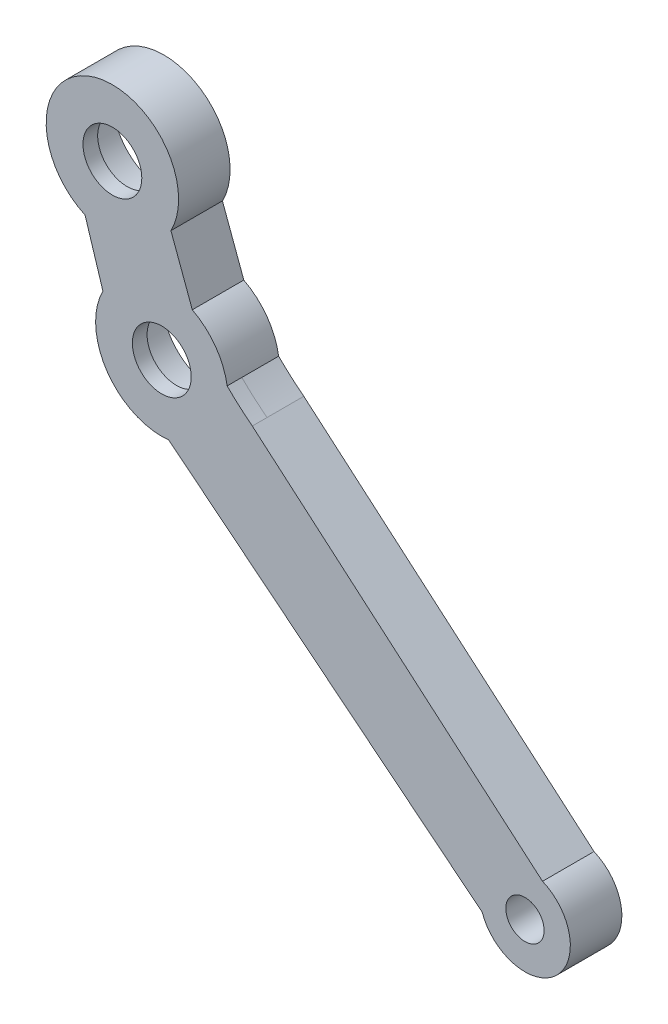
ISO-10303-21;
HEADER;
FILE_DESCRIPTION(('STEP AP214'),'2;1');
FILE_NAME('part.step','',(''),(''),'','','');
FILE_SCHEMA(('AUTOMOTIVE_DESIGN { 1 0 10303 214 1 1 1 1 }'));
ENDSEC;
DATA;
#1=APPLICATION_CONTEXT('core data for automotive mechanical design processes');
#2=APPLICATION_PROTOCOL_DEFINITION('international standard','automotive_design',2000,#1);
#3=PRODUCT_CONTEXT('',#1,'mechanical');
#4=PRODUCT('Part','Part','',(#3));
#5=PRODUCT_RELATED_PRODUCT_CATEGORY('part','',(#4));
#6=PRODUCT_DEFINITION_FORMATION('','',#4);
#7=PRODUCT_DEFINITION_CONTEXT('part definition',#1,'design');
#8=PRODUCT_DEFINITION('design','',#6,#7);
#9=PRODUCT_DEFINITION_SHAPE('','',#8);
#10=(LENGTH_UNIT() NAMED_UNIT(*) SI_UNIT(.MILLI.,.METRE.));
#11=(NAMED_UNIT(*) PLANE_ANGLE_UNIT() SI_UNIT($,.RADIAN.));
#12=(NAMED_UNIT(*) SI_UNIT($,.STERADIAN.) SOLID_ANGLE_UNIT());
#13=UNCERTAINTY_MEASURE_WITH_UNIT(LENGTH_MEASURE(1.E-05),#10,'distance_accuracy_value','');
#14=(GEOMETRIC_REPRESENTATION_CONTEXT(3) GLOBAL_UNCERTAINTY_ASSIGNED_CONTEXT((#13)) GLOBAL_UNIT_ASSIGNED_CONTEXT((#10,
#11,#12)) REPRESENTATION_CONTEXT('',''));
#15=CARTESIAN_POINT('',(0.,0.,0.));
#16=DIRECTION('',(0.,0.,1.));
#17=DIRECTION('',(1.,0.,0.));
#18=AXIS2_PLACEMENT_3D('',#15,#16,#17);
#19=CARTESIAN_POINT('',(-10.304986732744,-104.583172060792,5.68177365551215));
#20=DIRECTION('',(-0.651405865815987,-0.758729462971173,0.));
#21=DIRECTION('',(0.758729462971173,-0.651405865815987,0.));
#22=AXIS2_PLACEMENT_3D('',#19,#20,#21);
#23=PLANE('',#22);
#24=DIRECTION('',(-0.758729462971173,0.651405865815987,0.));
#25=VECTOR('',#24,1.);
#26=CARTESIAN_POINT('',(-10.304986732744,-104.583172060792,-1.81822634448785));
#27=LINE('',#26,#25);
#28=CARTESIAN_POINT('',(-102.562426797745,-25.3757067434847,-1.81822634448785));
#29=VERTEX_POINT('',#28);
#30=CARTESIAN_POINT('',(-161.728376156149,25.4211165638765,-1.81822634448785));
#31=VERTEX_POINT('',#30);
#32=EDGE_CURVE('E114',#29,#31,#27,.T.);
#33=ORIENTED_EDGE('',*,*,#32,.T.);
#34=DIRECTION('',(0.,0.,-1.));
#35=VECTOR('',#34,1.);
#36=CARTESIAN_POINT('',(-161.728376156149,25.4211165638765,5.68177365551215));
#37=LINE('',#36,#35);
#38=CARTESIAN_POINT('',(-161.728376156149,25.4211165638765,5.68177365551215));
#39=VERTEX_POINT('',#38);
#40=EDGE_CURVE('E11',#39,#31,#37,.T.);
#41=ORIENTED_EDGE('',*,*,#40,.F.);
#42=DIRECTION('',(0.,0.,-1.));
#43=VECTOR('',#42,1.);
#44=CARTESIAN_POINT('',(-161.728376156149,25.4211165638765,8.68177365551215));
#45=LINE('',#44,#43);
#46=CARTESIAN_POINT('',(-161.728376156149,25.4211165638765,8.68177365551215));
#47=VERTEX_POINT('',#46);
#48=EDGE_CURVE('E227',#47,#39,#45,.T.);
#49=ORIENTED_EDGE('',*,*,#48,.F.);
#50=DIRECTION('',(-0.758729462971173,0.651405865815987,0.));
#51=VECTOR('',#50,1.);
#52=CARTESIAN_POINT('',(-102.562426797745,-25.3757067434847,8.68177365551215));
#53=LINE('',#52,#51);
#54=CARTESIAN_POINT('',(-102.562426797745,-25.3757067434847,8.68177365551215));
#55=VERTEX_POINT('',#54);
#56=EDGE_CURVE('E117',#55,#47,#53,.T.);
#57=ORIENTED_EDGE('',*,*,#56,.F.);
#58=DIRECTION('',(0.,0.,-1.));
#59=VECTOR('',#58,1.);
#60=CARTESIAN_POINT('',(-102.562426797745,-25.3757067434847,5.68177365551215));
#61=LINE('',#60,#59);
#62=EDGE_CURVE('E103',#55,#29,#61,.T.);
#63=ORIENTED_EDGE('',*,*,#62,.T.);
#64=EDGE_LOOP('',(#33,#41,#49,#57,#63));
#65=FACE_BOUND('',#64,.T.);
#66=ADVANCED_FACE('F44',(#65),#23,.F.);
#67=CARTESIAN_POINT('',(1125655.02119039,991330.549946834,5.68177365551215));
#68=CARTESIAN_POINT('',(-1117767.06155338,-1000454.93945876,5.68177365551215));
#69=CARTESIAN_POINT('',(1109204.4083246,1009706.78276624,5.68177365551215));
#70=B_SPLINE_CURVE_WITH_KNOTS('',2,(#67,#68,#69),.UNSPECIFIED.,.F.,.F.,(3,3),(0.,1.),.UNSPECIFIED.);
#71=DIRECTION('',(0.,0.,-1.));
#72=VECTOR('',#71,1.);
#73=SURFACE_OF_LINEAR_EXTRUSION('',#70,#72);
#74=CARTESIAN_POINT('',(1125655.02119039,991330.549946834,-1.81822634448785));
#75=CARTESIAN_POINT('',(-1117767.06155338,-1000454.93945876,-1.81822634448785));
#76=CARTESIAN_POINT('',(1109204.4083246,1009706.78276624,-1.81822634448785));
#77=B_SPLINE_CURVE_WITH_KNOTS('',2,(#74,#75,#76),.UNSPECIFIED.,.F.,.F.,(3,3),(0.,1.),.UNSPECIFIED.);
#78=CARTESIAN_POINT('',(-166.855713911325,29.9366838128217,-1.81822634448785));
#79=VERTEX_POINT('',#78);
#80=EDGE_CURVE('E123',#31,#79,#77,.T.);
#81=ORIENTED_EDGE('',*,*,#80,.T.);
#82=DIRECTION('',(0.,0.,-1.));
#83=VECTOR('',#82,1.);
#84=CARTESIAN_POINT('',(-166.855713911325,29.9366838128217,5.68177365551215));
#85=LINE('',#84,#83);
#86=CARTESIAN_POINT('',(-166.855713911325,29.9366838128217,5.68177365551215));
#87=VERTEX_POINT('',#86);
#88=EDGE_CURVE('E54',#87,#79,#85,.T.);
#89=ORIENTED_EDGE('',*,*,#88,.F.);
#90=EDGE_CURVE('E109',#39,#87,#70,.T.);
#91=ORIENTED_EDGE('',*,*,#90,.F.);
#92=ORIENTED_EDGE('',*,*,#40,.T.);
#93=EDGE_LOOP('',(#81,#89,#91,#92));
#94=FACE_BOUND('',#93,.T.);
#95=ADVANCED_FACE('F249',(#94),#73,.F.);
#96=CARTESIAN_POINT('',(-180.182182863255,27.8582932732403,5.68177365551215));
#97=DIRECTION('',(0.,0.,-1.));
#98=DIRECTION('',(-1.,0.,0.));
#99=AXIS2_PLACEMENT_3D('',#96,#97,#98);
#100=CYLINDRICAL_SURFACE('',#99,13.4875676814531);
#101=CARTESIAN_POINT('',(-180.182182863255,27.8582932732403,-1.81822634448785));
#102=DIRECTION('',(0.,0.,1.));
#103=DIRECTION('',(1.,0.,0.));
#104=AXIS2_PLACEMENT_3D('',#101,#102,#103);
#105=CIRCLE('',#104,13.4875676814531);
#106=CARTESIAN_POINT('',(-173.958949505375,39.8243222108265,-1.81822634448785));
#107=VERTEX_POINT('',#106);
#108=EDGE_CURVE('E129',#79,#107,#105,.T.);
#109=ORIENTED_EDGE('',*,*,#108,.T.);
#110=DIRECTION('',(0.,0.,-1.));
#111=VECTOR('',#110,1.);
#112=CARTESIAN_POINT('',(-173.958949505375,39.8243222108265,5.68177365551215));
#113=LINE('',#112,#111);
#114=CARTESIAN_POINT('',(-173.958949495106,39.8243222305722,8.68177365551215));
#115=VERTEX_POINT('',#114);
#116=EDGE_CURVE('E174',#115,#107,#113,.T.);
#117=ORIENTED_EDGE('',*,*,#116,.F.);
#118=CARTESIAN_POINT('',(-180.182182863255,27.8582932732403,8.68177365551215));
#119=DIRECTION('',(0.,0.,1.));
#120=DIRECTION('',(1.,0.,0.));
#121=AXIS2_PLACEMENT_3D('',#118,#119,#120);
#122=CIRCLE('',#121,13.4875677037096);
#123=CARTESIAN_POINT('',(-166.855713804423,29.9366837051627,8.68177365551215));
#124=VERTEX_POINT('',#123);
#125=EDGE_CURVE('E214',#124,#115,#122,.T.);
#126=ORIENTED_EDGE('',*,*,#125,.F.);
#127=DIRECTION('',(0.,0.,-1.));
#128=VECTOR('',#127,1.);
#129=CARTESIAN_POINT('',(-166.855713804423,29.9366837051627,8.68177365551215));
#130=LINE('',#129,#128);
#131=EDGE_CURVE('E184',#124,#87,#130,.T.);
#132=ORIENTED_EDGE('',*,*,#131,.T.);
#133=ORIENTED_EDGE('',*,*,#88,.T.);
#134=EDGE_LOOP('',(#109,#117,#126,#132,#133));
#135=FACE_BOUND('',#134,.T.);
#136=ADVANCED_FACE('F180',(#135),#100,.T.);
#137=CARTESIAN_POINT('',(-129.667144340121,-80.0454105266062,5.68177365551215));
#138=DIRECTION('',(-0.938014544046687,-0.346595896047381,0.));
#139=DIRECTION('',(0.346595896047381,-0.938014544046687,0.));
#140=AXIS2_PLACEMENT_3D('',#137,#138,#139);
#141=PLANE('',#140);
#142=DIRECTION('',(-0.346595896047381,0.938014544046687,0.));
#143=VECTOR('',#142,1.);
#144=CARTESIAN_POINT('',(-129.667144340121,-80.0454105266062,-1.81822634448785));
#145=LINE('',#144,#143);
#146=CARTESIAN_POINT('',(-178.317702817252,51.6206938559562,-1.81822634448785));
#147=VERTEX_POINT('',#146);
#148=EDGE_CURVE('E143',#107,#147,#145,.T.);
#149=ORIENTED_EDGE('',*,*,#148,.T.);
#150=DIRECTION('',(0.,0.,-1.));
#151=VECTOR('',#150,1.);
#152=CARTESIAN_POINT('',(-178.317702817252,51.6206938559562,5.68177365551215));
#153=LINE('',#152,#151);
#154=CARTESIAN_POINT('',(-178.317702817252,51.6206938559562,8.68177365551215));
#155=VERTEX_POINT('',#154);
#156=EDGE_CURVE('E170',#155,#147,#153,.T.);
#157=ORIENTED_EDGE('',*,*,#156,.F.);
#158=DIRECTION('',(-0.346595896047381,0.938014544046686,0.));
#159=VECTOR('',#158,1.);
#160=CARTESIAN_POINT('',(-173.958949505375,39.8243222108265,8.68177365551215));
#161=LINE('',#160,#159);
#162=EDGE_CURVE('E208',#115,#155,#161,.T.);
#163=ORIENTED_EDGE('',*,*,#162,.F.);
#164=ORIENTED_EDGE('',*,*,#116,.T.);
#165=EDGE_LOOP('',(#149,#157,#163,#164));
#166=FACE_BOUND('',#165,.T.);
#167=ADVANCED_FACE('F190',(#166),#141,.F.);
#168=CARTESIAN_POINT('',(-190.253513875317,57.9283411500087,5.68177365551215));
#169=DIRECTION('',(0.,0.,-1.));
#170=DIRECTION('',(-1.,0.,0.));
#171=AXIS2_PLACEMENT_3D('',#168,#169,#170);
#172=CYLINDRICAL_SURFACE('',#171,13.5);
#173=CARTESIAN_POINT('',(-190.253513875317,57.9283411500087,-1.81822634448785));
#174=DIRECTION('',(0.,0.,1.));
#175=DIRECTION('',(1.,0.,0.));
#176=AXIS2_PLACEMENT_3D('',#173,#174,#175);
#177=CIRCLE('',#176,13.5);
#178=CARTESIAN_POINT('',(-195.824418154913,45.6313892712878,-1.81822634448785));
#179=VERTEX_POINT('',#178);
#180=EDGE_CURVE('E146',#147,#179,#177,.T.);
#181=ORIENTED_EDGE('',*,*,#180,.T.);
#182=DIRECTION('',(0.,0.,-1.));
#183=VECTOR('',#182,1.);
#184=CARTESIAN_POINT('',(-195.824418154913,45.6313892712878,5.68177365551215));
#185=LINE('',#184,#183);
#186=CARTESIAN_POINT('',(-195.824418154913,45.6313892712878,8.68177365551215));
#187=VERTEX_POINT('',#186);
#188=EDGE_CURVE('E166',#187,#179,#185,.T.);
#189=ORIENTED_EDGE('',*,*,#188,.F.);
#190=CARTESIAN_POINT('',(-190.253513875317,57.9283411500087,8.68177365551215));
#191=DIRECTION('',(0.,0.,1.));
#192=DIRECTION('',(1.,0.,0.));
#193=AXIS2_PLACEMENT_3D('',#190,#191,#192);
#194=CIRCLE('',#193,13.5);
#195=EDGE_CURVE('E199',#155,#187,#194,.T.);
#196=ORIENTED_EDGE('',*,*,#195,.F.);
#197=ORIENTED_EDGE('',*,*,#156,.T.);
#198=EDGE_LOOP('',(#181,#189,#196,#197));
#199=FACE_BOUND('',#198,.T.);
#200=ADVANCED_FACE('F196',(#199),#172,.T.);
#201=CARTESIAN_POINT('',(-157.308177848066,-77.2059147968634,5.68177365551215));
#202=DIRECTION('',(0.954192963420192,0.2991918925362,0.));
#203=DIRECTION('',(-0.2991918925362,0.954192963420192,0.));
#204=AXIS2_PLACEMENT_3D('',#201,#202,#203);
#205=PLANE('',#204);
#206=DIRECTION('',(0.2991918925362,-0.954192963420192,0.));
#207=VECTOR('',#206,1.);
#208=CARTESIAN_POINT('',(-157.308177848066,-77.2059147968634,-1.81822634448785));
#209=LINE('',#208,#207);
#210=CARTESIAN_POINT('',(-192.182244828685,34.0156461775026,-1.81822634448785));
#211=VERTEX_POINT('',#210);
#212=EDGE_CURVE('E149',#179,#211,#209,.T.);
#213=ORIENTED_EDGE('',*,*,#212,.T.);
#214=DIRECTION('',(0.,0.,-1.));
#215=VECTOR('',#214,1.);
#216=CARTESIAN_POINT('',(-192.182244828685,34.0156461775026,5.68177365551215));
#217=LINE('',#216,#215);
#218=CARTESIAN_POINT('',(-192.182244828685,34.0156461775026,8.68177365551215));
#219=VERTEX_POINT('',#218);
#220=EDGE_CURVE('E162',#219,#211,#217,.T.);
#221=ORIENTED_EDGE('',*,*,#220,.F.);
#222=DIRECTION('',(0.2991918925362,-0.954192963420192,0.));
#223=VECTOR('',#222,1.);
#224=CARTESIAN_POINT('',(-195.824418154913,45.6313892712878,8.68177365551215));
#225=LINE('',#224,#223);
#226=EDGE_CURVE('E207',#187,#219,#225,.T.);
#227=ORIENTED_EDGE('',*,*,#226,.F.);
#228=ORIENTED_EDGE('',*,*,#188,.T.);
#229=EDGE_LOOP('',(#213,#221,#227,#228));
#230=FACE_BOUND('',#229,.T.);
#231=ADVANCED_FACE('F337',(#230),#205,.F.);
#232=CARTESIAN_POINT('',(-180.182182863255,27.8582932732403,5.68177365551215));
#233=DIRECTION('',(0.,0.,-1.));
#234=DIRECTION('',(-1.,0.,0.));
#235=AXIS2_PLACEMENT_3D('',#232,#233,#234);
#236=CYLINDRICAL_SURFACE('',#235,13.4875676814531);
#237=CARTESIAN_POINT('',(-180.182182863255,27.8582932732403,-1.81822634448785));
#238=DIRECTION('',(0.,0.,1.));
#239=DIRECTION('',(1.,0.,0.));
#240=AXIS2_PLACEMENT_3D('',#237,#238,#239);
#241=CIRCLE('',#240,13.4875676814531);
#242=CARTESIAN_POINT('',(-178.777746482207,14.4440456084115,-1.81822634448785));
#243=VERTEX_POINT('',#242);
#244=EDGE_CURVE('E152',#211,#243,#241,.T.);
#245=ORIENTED_EDGE('',*,*,#244,.T.);
#246=DIRECTION('',(0.,0.,-1.));
#247=VECTOR('',#246,1.);
#248=CARTESIAN_POINT('',(-178.777746482207,14.4440456084115,5.68177365551215));
#249=LINE('',#248,#247);
#250=CARTESIAN_POINT('',(-178.777746482207,14.4440456084115,8.68177365551215));
#251=VERTEX_POINT('',#250);
#252=EDGE_CURVE('E159',#251,#243,#249,.T.);
#253=ORIENTED_EDGE('',*,*,#252,.F.);
#254=CARTESIAN_POINT('',(-180.182182863255,27.8582932732403,8.68177365551215));
#255=DIRECTION('',(0.,0.,1.));
#256=DIRECTION('',(1.,0.,0.));
#257=AXIS2_PLACEMENT_3D('',#254,#255,#256);
#258=CIRCLE('',#257,13.4875676814531);
#259=EDGE_CURVE('E212',#219,#251,#258,.T.);
#260=ORIENTED_EDGE('',*,*,#259,.F.);
#261=ORIENTED_EDGE('',*,*,#220,.T.);
#262=EDGE_LOOP('',(#245,#253,#260,#261));
#263=FACE_BOUND('',#262,.T.);
#264=ADVANCED_FACE('F334',(#263),#236,.T.);
#265=CARTESIAN_POINT('',(-15.0359852391694,-117.249538452131,5.68177365551215));
#266=DIRECTION('',(0.626724705023871,0.77924074849352,0.));
#267=DIRECTION('',(-0.77924074849352,0.626724705023871,0.));
#268=AXIS2_PLACEMENT_3D('',#265,#266,#267);
#269=PLANE('',#268);
#270=DIRECTION('',(0.77924074849352,-0.626724705023871,0.));
#271=VECTOR('',#270,1.);
#272=CARTESIAN_POINT('',(-15.0359852391694,-117.249538452131,-1.81822634448785));
#273=LINE('',#272,#271);
#274=CARTESIAN_POINT('',(-114.871454366241,-36.9542573589044,-1.81822634448785));
#275=VERTEX_POINT('',#274);
#276=EDGE_CURVE('E92',#243,#275,#273,.T.);
#277=ORIENTED_EDGE('',*,*,#276,.T.);
#278=DIRECTION('',(0.,0.,-1.));
#279=VECTOR('',#278,1.);
#280=CARTESIAN_POINT('',(-114.871454366241,-36.9542573589044,5.68177365551215));
#281=LINE('',#280,#279);
#282=CARTESIAN_POINT('',(-114.871454366241,-36.9542573589044,8.68177365551215));
#283=VERTEX_POINT('',#282);
#284=EDGE_CURVE('E105',#283,#275,#281,.T.);
#285=ORIENTED_EDGE('',*,*,#284,.F.);
#286=DIRECTION('',(0.77924074849352,-0.626724705023871,0.));
#287=VECTOR('',#286,1.);
#288=CARTESIAN_POINT('',(-178.777746482207,14.4440456084115,8.68177365551215));
#289=LINE('',#288,#287);
#290=EDGE_CURVE('E221',#251,#283,#289,.T.);
#291=ORIENTED_EDGE('',*,*,#290,.F.);
#292=ORIENTED_EDGE('',*,*,#252,.T.);
#293=EDGE_LOOP('',(#277,#285,#291,#292));
#294=FACE_BOUND('',#293,.T.);
#295=ADVANCED_FACE('F259',(#294),#269,.F.);
#296=CARTESIAN_POINT('',(-106.13890499212,-33.9056628326092,5.68177365551215));
#297=DIRECTION('',(0.,0.,-1.));
#298=DIRECTION('',(-1.,0.,0.));
#299=AXIS2_PLACEMENT_3D('',#296,#297,#298);
#300=CYLINDRICAL_SURFACE('',#299,3.90000000000001);
#301=CARTESIAN_POINT('',(-106.13890499212,-33.9056628326092,-1.81822634448785));
#302=DIRECTION('',(0.,0.,1.));
#303=DIRECTION('',(1.,0.,0.));
#304=AXIS2_PLACEMENT_3D('',#301,#302,#303);
#305=CIRCLE('',#304,3.90000000000001);
#306=CARTESIAN_POINT('',(-102.23890499212,-33.9056628326092,-1.81822634448785));
#307=VERTEX_POINT('',#306);
#308=EDGE_CURVE('E125',#307,#307,#305,.T.);
#309=ORIENTED_EDGE('',*,*,#308,.F.);
#310=EDGE_LOOP('',(#309));
#311=FACE_BOUND('',#310,.T.);
#312=CARTESIAN_POINT('',(-106.13890499212,-33.9056628326092,8.68177365551215));
#313=DIRECTION('',(0.,0.,1.));
#314=DIRECTION('',(1.,0.,0.));
#315=AXIS2_PLACEMENT_3D('',#312,#313,#314);
#316=CIRCLE('',#315,3.89999999998165);
#317=CARTESIAN_POINT('',(-102.238904992138,-33.9056628326092,8.68177365551215));
#318=VERTEX_POINT('',#317);
#319=EDGE_CURVE('E286',#318,#318,#316,.T.);
#320=ORIENTED_EDGE('',*,*,#319,.T.);
#321=EDGE_LOOP('',(#320));
#322=FACE_BOUND('',#321,.T.);
#323=ADVANCED_FACE('F256',(#311,#322),#300,.F.);
#324=CARTESIAN_POINT('',(-190.253513875317,57.9283411500087,5.68177365551215));
#325=DIRECTION('',(0.,0.,-1.));
#326=DIRECTION('',(-1.,0.,0.));
#327=AXIS2_PLACEMENT_3D('',#324,#325,#326);
#328=CYLINDRICAL_SURFACE('',#327,10.35);
#329=CARTESIAN_POINT('',(-190.253513875317,57.9283411500087,5.68177365551215));
#330=DIRECTION('',(0.,0.,1.));
#331=DIRECTION('',(1.,0.,0.));
#332=AXIS2_PLACEMENT_3D('',#329,#330,#331);
#333=CIRCLE('',#332,10.35);
#334=CARTESIAN_POINT('',(-179.903513875317,57.9283411500087,5.68177365551215));
#335=VERTEX_POINT('',#334);
#336=EDGE_CURVE('E231',#335,#335,#333,.T.);
#337=ORIENTED_EDGE('',*,*,#336,.T.);
#338=EDGE_LOOP('',(#337));
#339=FACE_BOUND('',#338,.T.);
#340=CARTESIAN_POINT('',(-190.253513875317,57.9283411500087,-1.81822634448785));
#341=DIRECTION('',(0.,0.,1.));
#342=DIRECTION('',(1.,0.,0.));
#343=AXIS2_PLACEMENT_3D('',#340,#341,#342);
#344=CIRCLE('',#343,10.35);
#345=CARTESIAN_POINT('',(-179.903513875317,57.9283411500087,-1.81822634448785));
#346=VERTEX_POINT('',#345);
#347=EDGE_CURVE('E132',#346,#346,#344,.T.);
#348=ORIENTED_EDGE('',*,*,#347,.F.);
#349=EDGE_LOOP('',(#348));
#350=FACE_BOUND('',#349,.T.);
#351=ADVANCED_FACE('F258',(#339,#350),#328,.F.);
#352=CARTESIAN_POINT('',(-180.182182863255,27.8582932732403,5.68177365551215));
#353=DIRECTION('',(0.,0.,-1.));
#354=DIRECTION('',(-1.,0.,0.));
#355=AXIS2_PLACEMENT_3D('',#352,#353,#354);
#356=CYLINDRICAL_SURFACE('',#355,10.3522799528935);
#357=CARTESIAN_POINT('',(-180.182182863255,27.8582932732403,5.68177365551215));
#358=DIRECTION('',(0.,0.,1.));
#359=DIRECTION('',(1.,0.,0.));
#360=AXIS2_PLACEMENT_3D('',#357,#358,#359);
#361=CIRCLE('',#360,10.3522799528935);
#362=CARTESIAN_POINT('',(-169.829902910361,27.8582932732403,5.68177365551215));
#363=VERTEX_POINT('',#362);
#364=EDGE_CURVE('E232',#363,#363,#361,.T.);
#365=ORIENTED_EDGE('',*,*,#364,.T.);
#366=EDGE_LOOP('',(#365));
#367=FACE_BOUND('',#366,.T.);
#368=CARTESIAN_POINT('',(-180.182182863255,27.8582932732403,-1.81822634448785));
#369=DIRECTION('',(0.,0.,1.));
#370=DIRECTION('',(1.,0.,0.));
#371=AXIS2_PLACEMENT_3D('',#368,#369,#370);
#372=CIRCLE('',#371,10.3522799528935);
#373=CARTESIAN_POINT('',(-169.829902910361,27.8582932732403,-1.81822634448785));
#374=VERTEX_POINT('',#373);
#375=EDGE_CURVE('E236',#374,#374,#372,.T.);
#376=ORIENTED_EDGE('',*,*,#375,.F.);
#377=EDGE_LOOP('',(#376));
#378=FACE_BOUND('',#377,.T.);
#379=ADVANCED_FACE('F46',(#367,#378),#356,.F.);
#380=CARTESIAN_POINT('',(-106.13890499212,-33.9056628326092,5.68177365551215));
#381=DIRECTION('',(0.,0.,-1.));
#382=DIRECTION('',(-1.,0.,0.));
#383=AXIS2_PLACEMENT_3D('',#380,#381,#382);
#384=CYLINDRICAL_SURFACE('',#383,9.24939712398743);
#385=CARTESIAN_POINT('',(-106.13890499212,-33.9056628326092,-1.81822634448785));
#386=DIRECTION('',(0.,0.,1.));
#387=DIRECTION('',(1.,0.,0.));
#388=AXIS2_PLACEMENT_3D('',#385,#386,#387);
#389=CIRCLE('',#388,9.24939712398743);
#390=EDGE_CURVE('E98',#275,#29,#389,.T.);
#391=ORIENTED_EDGE('',*,*,#390,.T.);
#392=ORIENTED_EDGE('',*,*,#62,.F.);
#393=CARTESIAN_POINT('',(-106.13890499212,-33.9056628326092,8.68177365551215));
#394=DIRECTION('',(0.,0.,1.));
#395=DIRECTION('',(1.,0.,0.));
#396=AXIS2_PLACEMENT_3D('',#393,#394,#395);
#397=CIRCLE('',#396,9.24939712398742);
#398=EDGE_CURVE('E304',#283,#55,#397,.T.);
#399=ORIENTED_EDGE('',*,*,#398,.F.);
#400=ORIENTED_EDGE('',*,*,#284,.T.);
#401=EDGE_LOOP('',(#391,#392,#399,#400));
#402=FACE_BOUND('',#401,.T.);
#403=ADVANCED_FACE('F100',(#402),#384,.T.);
#404=CARTESIAN_POINT('',(76.0092292292584,-4.04809529787038,-1.81822634448785));
#405=DIRECTION('',(0.,0.,1.));
#406=DIRECTION('',(1.,0.,0.));
#407=AXIS2_PLACEMENT_3D('',#404,#405,#406);
#408=PLANE('',#407);
#409=ORIENTED_EDGE('',*,*,#375,.T.);
#410=EDGE_LOOP('',(#409));
#411=FACE_BOUND('',#410,.T.);
#412=ORIENTED_EDGE('',*,*,#347,.T.);
#413=EDGE_LOOP('',(#412));
#414=FACE_BOUND('',#413,.T.);
#415=ORIENTED_EDGE('',*,*,#308,.T.);
#416=EDGE_LOOP('',(#415));
#417=FACE_BOUND('',#416,.T.);
#418=ORIENTED_EDGE('',*,*,#32,.F.);
#419=ORIENTED_EDGE('',*,*,#390,.F.);
#420=ORIENTED_EDGE('',*,*,#276,.F.);
#421=ORIENTED_EDGE('',*,*,#244,.F.);
#422=ORIENTED_EDGE('',*,*,#212,.F.);
#423=ORIENTED_EDGE('',*,*,#180,.F.);
#424=ORIENTED_EDGE('',*,*,#148,.F.);
#425=ORIENTED_EDGE('',*,*,#108,.F.);
#426=ORIENTED_EDGE('',*,*,#80,.F.);
#427=EDGE_LOOP('',(#418,#419,#420,#421,#422,#423,#424,#425,#426));
#428=FACE_BOUND('',#427,.T.);
#429=ADVANCED_FACE('F121',(#411,#414,#417,#428),#408,.F.);
#430=CARTESIAN_POINT('',(-106.13890499212,-33.9056628326092,5.68177365551215));
#431=DIRECTION('',(0.,0.,1.));
#432=DIRECTION('',(1.,0.,0.));
#433=AXIS2_PLACEMENT_3D('',#430,#431,#432);
#434=PLANE('',#433);
#435=CARTESIAN_POINT('',(-180.182182863255,27.8582932732403,5.68177365551215));
#436=DIRECTION('',(0.,0.,1.));
#437=DIRECTION('',(1.,0.,0.));
#438=AXIS2_PLACEMENT_3D('',#435,#436,#437);
#439=CIRCLE('',#438,5.99999999999999);
#440=CARTESIAN_POINT('',(-174.182182863255,27.8582932732403,5.68177365551215));
#441=VERTEX_POINT('',#440);
#442=EDGE_CURVE('E289',#441,#441,#439,.T.);
#443=ORIENTED_EDGE('',*,*,#442,.T.);
#444=EDGE_LOOP('',(#443));
#445=FACE_BOUND('',#444,.T.);
#446=ORIENTED_EDGE('',*,*,#364,.F.);
#447=EDGE_LOOP('',(#446));
#448=FACE_BOUND('',#447,.T.);
#449=ADVANCED_FACE('F279',(#445,#448),#434,.F.);
#450=CARTESIAN_POINT('',(-190.253513875317,57.9283411500087,5.68177365551215));
#451=DIRECTION('',(0.,0.,1.));
#452=DIRECTION('',(1.,0.,0.));
#453=AXIS2_PLACEMENT_3D('',#450,#451,#452);
#454=CIRCLE('',#453,5.99999999999999);
#455=CARTESIAN_POINT('',(-184.253513875317,57.9283411500087,5.68177365551215));
#456=VERTEX_POINT('',#455);
#457=EDGE_CURVE('E298',#456,#456,#454,.T.);
#458=ORIENTED_EDGE('',*,*,#457,.T.);
#459=EDGE_LOOP('',(#458));
#460=FACE_BOUND('',#459,.T.);
#461=ORIENTED_EDGE('',*,*,#336,.F.);
#462=EDGE_LOOP('',(#461));
#463=FACE_BOUND('',#462,.T.);
#464=ADVANCED_FACE('F473',(#460,#463),#434,.F.);
#465=CARTESIAN_POINT('',(-106.13890499212,-33.9056628326092,8.68177365551215));
#466=DIRECTION('',(0.,0.,1.));
#467=DIRECTION('',(1.,0.,0.));
#468=AXIS2_PLACEMENT_3D('',#465,#466,#467);
#469=PLANE('',#468);
#470=CARTESIAN_POINT('',(-180.182182863255,27.8582932732403,8.68177365551215));
#471=DIRECTION('',(0.,0.,1.));
#472=DIRECTION('',(1.,0.,0.));
#473=AXIS2_PLACEMENT_3D('',#470,#471,#472);
#474=CIRCLE('',#473,5.99999999999999);
#475=CARTESIAN_POINT('',(-174.182182863255,27.8582932732403,8.68177365551215));
#476=VERTEX_POINT('',#475);
#477=EDGE_CURVE('E293',#476,#476,#474,.T.);
#478=ORIENTED_EDGE('',*,*,#477,.F.);
#479=EDGE_LOOP('',(#478));
#480=FACE_BOUND('',#479,.T.);
#481=ORIENTED_EDGE('',*,*,#398,.T.);
#482=ORIENTED_EDGE('',*,*,#56,.T.);
#483=CARTESIAN_POINT('',(1125655.02119045,991330.549946764,8.68177365551215));
#484=CARTESIAN_POINT('',(-1117767.06155343,-1000454.9394587,8.68177365551215));
#485=CARTESIAN_POINT('',(1109204.40832464,1009706.78276619,8.68177365551215));
#486=B_SPLINE_CURVE_WITH_KNOTS('',2,(#483,#484,#485),.UNSPECIFIED.,.F.,.F.,(3,3),(0.,1.),.UNSPECIFIED.);
#487=EDGE_CURVE('E312',#47,#124,#486,.T.);
#488=ORIENTED_EDGE('',*,*,#487,.T.);
#489=ORIENTED_EDGE('',*,*,#125,.T.);
#490=ORIENTED_EDGE('',*,*,#162,.T.);
#491=ORIENTED_EDGE('',*,*,#195,.T.);
#492=ORIENTED_EDGE('',*,*,#226,.T.);
#493=ORIENTED_EDGE('',*,*,#259,.T.);
#494=ORIENTED_EDGE('',*,*,#290,.T.);
#495=EDGE_LOOP('',(#481,#482,#488,#489,#490,#491,#492,#493,#494));
#496=FACE_BOUND('',#495,.T.);
#497=CARTESIAN_POINT('',(-190.253513875317,57.9283411500087,8.68177365551215));
#498=DIRECTION('',(0.,0.,1.));
#499=DIRECTION('',(1.,0.,0.));
#500=AXIS2_PLACEMENT_3D('',#497,#498,#499);
#501=CIRCLE('',#500,5.99999999999999);
#502=CARTESIAN_POINT('',(-184.253513875317,57.9283411500087,8.68177365551215));
#503=VERTEX_POINT('',#502);
#504=EDGE_CURVE('E300',#503,#503,#501,.T.);
#505=ORIENTED_EDGE('',*,*,#504,.F.);
#506=EDGE_LOOP('',(#505));
#507=FACE_BOUND('',#506,.T.);
#508=ORIENTED_EDGE('',*,*,#319,.F.);
#509=EDGE_LOOP('',(#508));
#510=FACE_BOUND('',#509,.T.);
#511=ADVANCED_FACE('F326',(#480,#496,#507,#510),#469,.T.);
#512=DIRECTION('',(0.,0.,-1.));
#513=VECTOR('',#512,1.);
#514=SURFACE_OF_LINEAR_EXTRUSION('',#486,#513);
#515=ORIENTED_EDGE('',*,*,#90,.T.);
#516=ORIENTED_EDGE('',*,*,#131,.F.);
#517=ORIENTED_EDGE('',*,*,#487,.F.);
#518=ORIENTED_EDGE('',*,*,#48,.T.);
#519=EDGE_LOOP('',(#515,#516,#517,#518));
#520=FACE_BOUND('',#519,.T.);
#521=ADVANCED_FACE('F322',(#520),#514,.F.);
#522=CARTESIAN_POINT('',(-190.253513875317,57.9283411500087,8.68177365551215));
#523=DIRECTION('',(0.,0.,-1.));
#524=DIRECTION('',(-1.,0.,0.));
#525=AXIS2_PLACEMENT_3D('',#522,#523,#524);
#526=CYLINDRICAL_SURFACE('',#525,5.99999999999999);
#527=ORIENTED_EDGE('',*,*,#504,.T.);
#528=EDGE_LOOP('',(#527));
#529=FACE_BOUND('',#528,.T.);
#530=ORIENTED_EDGE('',*,*,#457,.F.);
#531=EDGE_LOOP('',(#530));
#532=FACE_BOUND('',#531,.T.);
#533=ADVANCED_FACE('F325',(#529,#532),#526,.F.);
#534=CARTESIAN_POINT('',(-180.182182863255,27.8582932732403,8.68177365551215));
#535=DIRECTION('',(0.,0.,-1.));
#536=DIRECTION('',(-1.,0.,0.));
#537=AXIS2_PLACEMENT_3D('',#534,#535,#536);
#538=CYLINDRICAL_SURFACE('',#537,5.99999999999999);
#539=ORIENTED_EDGE('',*,*,#477,.T.);
#540=EDGE_LOOP('',(#539));
#541=FACE_BOUND('',#540,.T.);
#542=ORIENTED_EDGE('',*,*,#442,.F.);
#543=EDGE_LOOP('',(#542));
#544=FACE_BOUND('',#543,.T.);
#545=ADVANCED_FACE('F508',(#541,#544),#538,.F.);
#546=CLOSED_SHELL('',(#66,#95,#136,#167,#200,#231,#264,#295,#323,#351,#379,#403,#429,#449,#464,
#511,#521,#533,#545));
#547=MANIFOLD_SOLID_BREP('B2',#546);
#548=ADVANCED_BREP_SHAPE_REPRESENTATION('',(#18,#547),#14);
#549=SHAPE_DEFINITION_REPRESENTATION(#9,#548);
ENDSEC;
END-ISO-10303-21;
